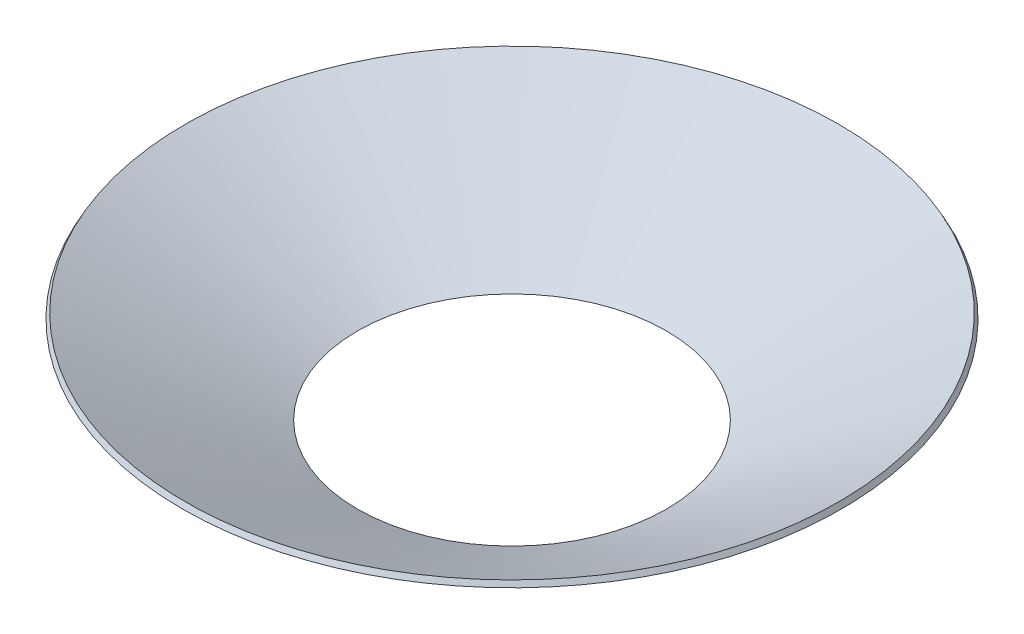
ISO-10303-21;
HEADER;
FILE_DESCRIPTION(('STEP AP214'),'2;1');
FILE_NAME('part.step','',(''),(''),'','','');
FILE_SCHEMA(('AUTOMOTIVE_DESIGN { 1 0 10303 214 1 1 1 1 }'));
ENDSEC;
DATA;
#1=APPLICATION_CONTEXT('core data for automotive mechanical design processes');
#2=APPLICATION_PROTOCOL_DEFINITION('international standard','automotive_design',2000,#1);
#3=PRODUCT_CONTEXT('',#1,'mechanical');
#4=PRODUCT('Part','Part','',(#3));
#5=PRODUCT_RELATED_PRODUCT_CATEGORY('part','',(#4));
#6=PRODUCT_DEFINITION_FORMATION('','',#4);
#7=PRODUCT_DEFINITION_CONTEXT('part definition',#1,'design');
#8=PRODUCT_DEFINITION('design','',#6,#7);
#9=PRODUCT_DEFINITION_SHAPE('','',#8);
#10=(LENGTH_UNIT() NAMED_UNIT(*) SI_UNIT(.MILLI.,.METRE.));
#11=(NAMED_UNIT(*) PLANE_ANGLE_UNIT() SI_UNIT($,.RADIAN.));
#12=(NAMED_UNIT(*) SI_UNIT($,.STERADIAN.) SOLID_ANGLE_UNIT());
#13=UNCERTAINTY_MEASURE_WITH_UNIT(LENGTH_MEASURE(1.E-05),#10,'distance_accuracy_value','');
#14=(GEOMETRIC_REPRESENTATION_CONTEXT(3) GLOBAL_UNCERTAINTY_ASSIGNED_CONTEXT((#13)) GLOBAL_UNIT_ASSIGNED_CONTEXT((#10,
#11,#12)) REPRESENTATION_CONTEXT('',''));
#15=CARTESIAN_POINT('',(0.,0.,0.));
#16=DIRECTION('',(0.,0.,1.));
#17=DIRECTION('',(1.,0.,0.));
#18=AXIS2_PLACEMENT_3D('',#15,#16,#17);
#19=CARTESIAN_POINT('',(-29.6132064597293,0.,0.));
#20=DIRECTION('',(0.,1.,0.));
#21=DIRECTION('',(0.,0.,1.));
#22=AXIS2_PLACEMENT_3D('',#19,#20,#21);
#23=PLANE('',#22);
#24=CARTESIAN_POINT('',(0.,0.,0.));
#25=DIRECTION('',(0.,-1.,0.));
#26=DIRECTION('',(0.,0.,-1.));
#27=AXIS2_PLACEMENT_3D('',#24,#25,#26);
#28=CIRCLE('',#27,27.5);
#29=CARTESIAN_POINT('',(0.,0.,-27.5));
#30=VERTEX_POINT('',#29);
#31=EDGE_CURVE('E10',#30,#30,#28,.T.);
#32=ORIENTED_EDGE('',*,*,#31,.F.);
#33=EDGE_LOOP('',(#32));
#34=FACE_BOUND('',#33,.T.);
#35=CARTESIAN_POINT('',(0.,0.,0.));
#36=DIRECTION('',(0.,-1.,0.));
#37=DIRECTION('',(0.,0.,-1.));
#38=AXIS2_PLACEMENT_3D('',#35,#36,#37);
#39=CIRCLE('',#38,29.6132064597293);
#40=CARTESIAN_POINT('',(0.,0.,-29.6132064597293));
#41=VERTEX_POINT('',#40);
#42=EDGE_CURVE('E45',#41,#41,#39,.T.);
#43=ORIENTED_EDGE('',*,*,#42,.T.);
#44=EDGE_LOOP('',(#43));
#45=FACE_BOUND('',#44,.T.);
#46=ADVANCED_FACE('F31',(#34,#45),#23,.F.);
#47=CARTESIAN_POINT('',(0.,0.,0.));
#48=DIRECTION('',(0.,1.,0.));
#49=DIRECTION('',(0.,0.,1.));
#50=AXIS2_PLACEMENT_3D('',#47,#48,#49);
#51=CONICAL_SURFACE('',#50,27.5,1.07786016342153);
#52=CARTESIAN_POINT('',(0.,16.5,0.));
#53=DIRECTION('',(0.,-1.,0.));
#54=DIRECTION('',(0.,0.,-1.));
#55=AXIS2_PLACEMENT_3D('',#52,#53,#54);
#56=CIRCLE('',#55,58.2167854707731);
#57=CARTESIAN_POINT('',(0.,16.5,-58.2167854707731));
#58=VERTEX_POINT('',#57);
#59=EDGE_CURVE('E37',#58,#58,#56,.T.);
#60=ORIENTED_EDGE('',*,*,#59,.F.);
#61=EDGE_LOOP('',(#60));
#62=FACE_BOUND('',#61,.T.);
#63=ORIENTED_EDGE('',*,*,#31,.T.);
#64=EDGE_LOOP('',(#63));
#65=FACE_BOUND('',#64,.T.);
#66=ADVANCED_FACE('F60',(#62,#65),#51,.F.);
#67=CARTESIAN_POINT('',(0.,16.5,0.));
#68=DIRECTION('',(0.,-1.,0.));
#69=DIRECTION('',(0.,0.,-1.));
#70=AXIS2_PLACEMENT_3D('',#67,#68,#69);
#71=CONICAL_SURFACE('',#70,58.2167854707731,0.492936163373364);
#72=CARTESIAN_POINT('',(0.,15.6190527772173,0.));
#73=DIRECTION('',(0.,-1.,0.));
#74=DIRECTION('',(0.,0.,-1.));
#75=AXIS2_PLACEMENT_3D('',#72,#73,#74);
#76=CIRCLE('',#75,58.69);
#77=CARTESIAN_POINT('',(0.,15.6190527772173,-58.69));
#78=VERTEX_POINT('',#77);
#79=EDGE_CURVE('E41',#78,#78,#76,.T.);
#80=ORIENTED_EDGE('',*,*,#79,.F.);
#81=EDGE_LOOP('',(#80));
#82=FACE_BOUND('',#81,.T.);
#83=ORIENTED_EDGE('',*,*,#59,.T.);
#84=EDGE_LOOP('',(#83));
#85=FACE_BOUND('',#84,.T.);
#86=ADVANCED_FACE('F55',(#82,#85),#71,.T.);
#87=CARTESIAN_POINT('',(0.,15.6190527772173,0.));
#88=DIRECTION('',(0.,1.,0.));
#89=DIRECTION('',(0.,0.,1.));
#90=AXIS2_PLACEMENT_3D('',#87,#88,#89);
#91=CONICAL_SURFACE('',#90,58.69,1.07786016342153);
#92=ORIENTED_EDGE('',*,*,#42,.F.);
#93=EDGE_LOOP('',(#92));
#94=FACE_BOUND('',#93,.T.);
#95=ORIENTED_EDGE('',*,*,#79,.T.);
#96=EDGE_LOOP('',(#95));
#97=FACE_BOUND('',#96,.T.);
#98=ADVANCED_FACE('F52',(#94,#97),#91,.T.);
#99=CLOSED_SHELL('',(#46,#66,#86,#98));
#100=MANIFOLD_SOLID_BREP('B2',#99);
#101=ADVANCED_BREP_SHAPE_REPRESENTATION('',(#18,#100),#14);
#102=SHAPE_DEFINITION_REPRESENTATION(#9,#101);
ENDSEC;
END-ISO-10303-21;
